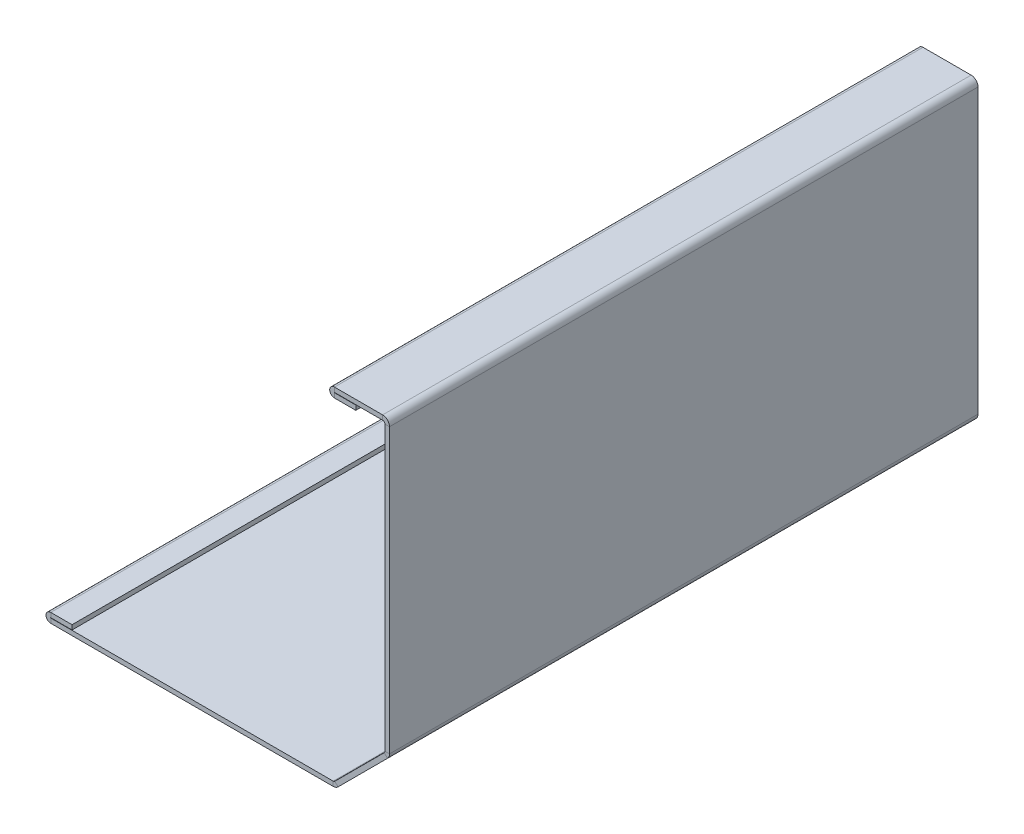
ISO-10303-21;
HEADER;
FILE_DESCRIPTION(('STEP AP214'),'2;1');
FILE_NAME('part.step','',(''),(''),'','','');
FILE_SCHEMA(('AUTOMOTIVE_DESIGN { 1 0 10303 214 1 1 1 1 }'));
ENDSEC;
DATA;
#1=APPLICATION_CONTEXT('core data for automotive mechanical design processes');
#2=APPLICATION_PROTOCOL_DEFINITION('international standard','automotive_design',2000,#1);
#3=PRODUCT_CONTEXT('',#1,'mechanical');
#4=PRODUCT('Part','Part','',(#3));
#5=PRODUCT_RELATED_PRODUCT_CATEGORY('part','',(#4));
#6=PRODUCT_DEFINITION_FORMATION('','',#4);
#7=PRODUCT_DEFINITION_CONTEXT('part definition',#1,'design');
#8=PRODUCT_DEFINITION('design','',#6,#7);
#9=PRODUCT_DEFINITION_SHAPE('','',#8);
#10=(LENGTH_UNIT() NAMED_UNIT(*) SI_UNIT(.MILLI.,.METRE.));
#11=(NAMED_UNIT(*) PLANE_ANGLE_UNIT() SI_UNIT($,.RADIAN.));
#12=(NAMED_UNIT(*) SI_UNIT($,.STERADIAN.) SOLID_ANGLE_UNIT());
#13=UNCERTAINTY_MEASURE_WITH_UNIT(LENGTH_MEASURE(1.E-05),#10,'distance_accuracy_value','');
#14=(GEOMETRIC_REPRESENTATION_CONTEXT(3) GLOBAL_UNCERTAINTY_ASSIGNED_CONTEXT((#13)) GLOBAL_UNIT_ASSIGNED_CONTEXT((#10,
#11,#12)) REPRESENTATION_CONTEXT('',''));
#15=CARTESIAN_POINT('',(0.,0.,0.));
#16=DIRECTION('',(0.,0.,1.));
#17=DIRECTION('',(1.,0.,0.));
#18=AXIS2_PLACEMENT_3D('',#15,#16,#17);
#19=CARTESIAN_POINT('',(65.0606601717799,18.0606601717797,-96.));
#20=DIRECTION('',(0.,0.,-1.));
#21=DIRECTION('',(-1.,0.,0.));
#22=AXIS2_PLACEMENT_3D('',#19,#20,#21);
#23=PLANE('',#22);
#24=DIRECTION('',(0.,-1.,0.));
#25=VECTOR('',#24,1.);
#26=CARTESIAN_POINT('',(63.5606601717799,18.0606601717797,-96.));
#27=LINE('',#26,#25);
#28=CARTESIAN_POINT('',(63.5606601717809,110.80273982822,-96.));
#29=VERTEX_POINT('',#28);
#30=CARTESIAN_POINT('',(63.5606601717799,18.3657698818238,-96.));
#31=VERTEX_POINT('',#30);
#32=EDGE_CURVE('E411',#29,#31,#27,.T.);
#33=ORIENTED_EDGE('',*,*,#32,.F.);
#34=DIRECTION('',(1.,0.,0.));
#35=VECTOR('',#34,1.);
#36=CARTESIAN_POINT('',(63.5606601717809,110.80273982822,-96.));
#37=LINE('',#36,#35);
#38=CARTESIAN_POINT('',(65.0606601717809,110.80273982822,-96.));
#39=VERTEX_POINT('',#38);
#40=EDGE_CURVE('E379',#29,#39,#37,.T.);
#41=ORIENTED_EDGE('',*,*,#40,.T.);
#42=DIRECTION('',(0.,-1.,0.));
#43=VECTOR('',#42,1.);
#44=CARTESIAN_POINT('',(65.0606601717799,18.0606601717797,-96.));
#45=LINE('',#44,#43);
#46=CARTESIAN_POINT('',(65.0606601717799,18.3657698818237,-96.));
#47=VERTEX_POINT('',#46);
#48=EDGE_CURVE('E410',#39,#47,#45,.T.);
#49=ORIENTED_EDGE('',*,*,#48,.T.);
#50=DIRECTION('',(1.,0.,0.));
#51=VECTOR('',#50,1.);
#52=CARTESIAN_POINT('',(63.5606601717799,18.3657698818238,-96.));
#53=LINE('',#52,#51);
#54=EDGE_CURVE('E398',#31,#47,#53,.T.);
#55=ORIENTED_EDGE('',*,*,#54,.F.);
#56=EDGE_LOOP('',(#33,#41,#49,#55));
#57=FACE_BOUND('',#56,.T.);
#58=ADVANCED_FACE('F59',(#57),#23,.T.);
#59=CARTESIAN_POINT('',(65.0606601717797,-6.93865979386305E-13,0.));
#60=DIRECTION('',(1.,0.,0.));
#61=DIRECTION('',(0.,1.,0.));
#62=AXIS2_PLACEMENT_3D('',#59,#60,#61);
#63=PLANE('',#62);
#64=ORIENTED_EDGE('',*,*,#48,.F.);
#65=DIRECTION('',(0.,0.,-1.));
#66=VECTOR('',#65,1.);
#67=CARTESIAN_POINT('',(65.0606601717809,110.80273982822,-95.9999999999999));
#68=LINE('',#67,#66);
#69=CARTESIAN_POINT('',(65.0606601717809,110.80273982822,96.));
#70=VERTEX_POINT('',#69);
#71=EDGE_CURVE('E372',#39,#70,#68,.F.);
#72=ORIENTED_EDGE('',*,*,#71,.T.);
#73=DIRECTION('',(0.,1.,0.));
#74=VECTOR('',#73,1.);
#75=CARTESIAN_POINT('',(65.0606601717809,113.03933982822,96.));
#76=LINE('',#75,#74);
#77=CARTESIAN_POINT('',(65.0606601717799,18.3657698818237,96.));
#78=VERTEX_POINT('',#77);
#79=EDGE_CURVE('E407',#78,#70,#76,.T.);
#80=ORIENTED_EDGE('',*,*,#79,.F.);
#81=DIRECTION('',(0.,0.,-1.));
#82=VECTOR('',#81,1.);
#83=CARTESIAN_POINT('',(65.0606601717799,18.3657698818237,0.));
#84=LINE('',#83,#82);
#85=EDGE_CURVE('E401',#78,#47,#84,.T.);
#86=ORIENTED_EDGE('',*,*,#85,.T.);
#87=EDGE_LOOP('',(#64,#72,#80,#86));
#88=FACE_BOUND('',#87,.T.);
#89=ADVANCED_FACE('F515',(#88),#63,.T.);
#90=CARTESIAN_POINT('',(63.5606601717797,-6.7796203455855E-13,0.));
#91=DIRECTION('',(1.,0.,0.));
#92=DIRECTION('',(0.,1.,0.));
#93=AXIS2_PLACEMENT_3D('',#90,#91,#92);
#94=PLANE('',#93);
#95=DIRECTION('',(0.,0.,-1.));
#96=VECTOR('',#95,1.);
#97=CARTESIAN_POINT('',(63.5606601717809,110.80273982822,-95.9999999999999));
#98=LINE('',#97,#96);
#99=CARTESIAN_POINT('',(63.5606601717809,110.80273982822,96.));
#100=VERTEX_POINT('',#99);
#101=EDGE_CURVE('E385',#29,#100,#98,.F.);
#102=ORIENTED_EDGE('',*,*,#101,.F.);
#103=ORIENTED_EDGE('',*,*,#32,.T.);
#104=DIRECTION('',(0.,0.,-1.));
#105=VECTOR('',#104,1.);
#106=CARTESIAN_POINT('',(63.5606601717799,18.3657698818238,96.));
#107=LINE('',#106,#105);
#108=CARTESIAN_POINT('',(63.5606601717799,18.3657698818238,96.));
#109=VERTEX_POINT('',#108);
#110=EDGE_CURVE('E395',#109,#31,#107,.T.);
#111=ORIENTED_EDGE('',*,*,#110,.F.);
#112=DIRECTION('',(0.,1.,0.));
#113=VECTOR('',#112,1.);
#114=CARTESIAN_POINT('',(63.5606601717809,113.03933982822,96.));
#115=LINE('',#114,#113);
#116=EDGE_CURVE('E406',#109,#100,#115,.T.);
#117=ORIENTED_EDGE('',*,*,#116,.T.);
#118=EDGE_LOOP('',(#102,#103,#111,#117));
#119=FACE_BOUND('',#118,.T.);
#120=ADVANCED_FACE('F526',(#119),#94,.F.);
#121=CARTESIAN_POINT('',(48.0606601717798,0.439339828220174,96.));
#122=DIRECTION('',(0.,0.,-1.));
#123=DIRECTION('',(-1.,0.,0.));
#124=AXIS2_PLACEMENT_3D('',#121,#122,#123);
#125=PLANE('',#124);
#126=DIRECTION('',(0.707106781186536,-0.707106781186559,0.));
#127=VECTOR('',#126,1.);
#128=CARTESIAN_POINT('',(63.3449150268019,17.8449150268018,96.));
#129=LINE('',#128,#127);
#130=CARTESIAN_POINT('',(63.3449150268019,17.8449150268018,96.));
#131=VERTEX_POINT('',#130);
#132=CARTESIAN_POINT('',(64.4055751985818,16.7842548550219,96.));
#133=VERTEX_POINT('',#132);
#134=EDGE_CURVE('E434',#131,#133,#129,.T.);
#135=ORIENTED_EDGE('',*,*,#134,.F.);
#136=DIRECTION('',(-0.707106781186551,-0.707106781186544,0.));
#137=VECTOR('',#136,1.);
#138=CARTESIAN_POINT('',(47.,1.5,96.));
#139=LINE('',#138,#137);
#140=CARTESIAN_POINT('',(47.215745144978,1.71574514497799,96.));
#141=VERTEX_POINT('',#140);
#142=EDGE_CURVE('E450',#131,#141,#139,.T.);
#143=ORIENTED_EDGE('',*,*,#142,.T.);
#144=DIRECTION('',(0.707106781186544,-0.707106781186551,0.));
#145=VECTOR('',#144,1.);
#146=CARTESIAN_POINT('',(47.215745144978,1.71574514497799,96.));
#147=LINE('',#146,#145);
#148=CARTESIAN_POINT('',(48.2764053167578,0.655084973198165,96.));
#149=VERTEX_POINT('',#148);
#150=EDGE_CURVE('E437',#141,#149,#147,.T.);
#151=ORIENTED_EDGE('',*,*,#150,.T.);
#152=DIRECTION('',(-0.707106781186551,-0.707106781186544,0.));
#153=VECTOR('',#152,1.);
#154=CARTESIAN_POINT('',(48.0606601717798,0.439339828220174,96.));
#155=LINE('',#154,#153);
#156=EDGE_CURVE('E451',#133,#149,#155,.T.);
#157=ORIENTED_EDGE('',*,*,#156,.F.);
#158=EDGE_LOOP('',(#135,#143,#151,#157));
#159=FACE_BOUND('',#158,.T.);
#160=ADVANCED_FACE('F534',(#159),#125,.F.);
#161=CARTESIAN_POINT('',(64.6213203435597,16.9999999999999,-96.));
#162=DIRECTION('',(0.,0.,1.));
#163=DIRECTION('',(1.,0.,0.));
#164=AXIS2_PLACEMENT_3D('',#161,#162,#163);
#165=PLANE('',#164);
#166=DIRECTION('',(0.707106781186536,-0.707106781186559,0.));
#167=VECTOR('',#166,1.);
#168=CARTESIAN_POINT('',(63.3449150268019,17.8449150268018,-96.));
#169=LINE('',#168,#167);
#170=CARTESIAN_POINT('',(63.3449150268019,17.8449150268018,-96.));
#171=VERTEX_POINT('',#170);
#172=CARTESIAN_POINT('',(64.4055751985817,16.7842548550219,-96.));
#173=VERTEX_POINT('',#172);
#174=EDGE_CURVE('E423',#171,#173,#169,.T.);
#175=ORIENTED_EDGE('',*,*,#174,.T.);
#176=DIRECTION('',(0.707106781186551,0.707106781186544,0.));
#177=VECTOR('',#176,1.);
#178=CARTESIAN_POINT('',(64.6213203435597,16.9999999999999,-96.));
#179=LINE('',#178,#177);
#180=CARTESIAN_POINT('',(48.2764053167578,0.655084973198164,-96.));
#181=VERTEX_POINT('',#180);
#182=EDGE_CURVE('E453',#181,#173,#179,.T.);
#183=ORIENTED_EDGE('',*,*,#182,.F.);
#184=DIRECTION('',(0.707106781186544,-0.707106781186551,0.));
#185=VECTOR('',#184,1.);
#186=CARTESIAN_POINT('',(47.215745144978,1.71574514497799,-96.));
#187=LINE('',#186,#185);
#188=CARTESIAN_POINT('',(47.215745144978,1.71574514497799,-96.));
#189=VERTEX_POINT('',#188);
#190=EDGE_CURVE('E442',#189,#181,#187,.T.);
#191=ORIENTED_EDGE('',*,*,#190,.F.);
#192=DIRECTION('',(0.707106781186551,0.707106781186544,0.));
#193=VECTOR('',#192,1.);
#194=CARTESIAN_POINT('',(63.5606601717799,18.0606601717797,-96.));
#195=LINE('',#194,#193);
#196=EDGE_CURVE('E454',#189,#171,#195,.T.);
#197=ORIENTED_EDGE('',*,*,#196,.T.);
#198=EDGE_LOOP('',(#175,#183,#191,#197));
#199=FACE_BOUND('',#198,.T.);
#200=ADVANCED_FACE('F498',(#199),#165,.F.);
#201=CARTESIAN_POINT('',(23.8106601717796,-23.8106601717798,0.));
#202=DIRECTION('',(-0.707106781186544,0.707106781186551,0.));
#203=DIRECTION('',(-0.707106781186551,-0.707106781186544,0.));
#204=AXIS2_PLACEMENT_3D('',#201,#202,#203);
#205=PLANE('',#204);
#206=DIRECTION('',(0.,0.,-1.));
#207=VECTOR('',#206,1.);
#208=CARTESIAN_POINT('',(64.4055751985817,16.7842548550219,-96.));
#209=LINE('',#208,#207);
#210=EDGE_CURVE('E417',#173,#133,#209,.F.);
#211=ORIENTED_EDGE('',*,*,#210,.T.);
#212=ORIENTED_EDGE('',*,*,#156,.T.);
#213=DIRECTION('',(0.,0.,1.));
#214=VECTOR('',#213,1.);
#215=CARTESIAN_POINT('',(48.2764053167578,0.655084973198158,0.));
#216=LINE('',#215,#214);
#217=EDGE_CURVE('E445',#181,#149,#216,.T.);
#218=ORIENTED_EDGE('',*,*,#217,.F.);
#219=ORIENTED_EDGE('',*,*,#182,.T.);
#220=EDGE_LOOP('',(#211,#212,#218,#219));
#221=FACE_BOUND('',#220,.T.);
#222=ADVANCED_FACE('F494',(#221),#205,.F.);
#223=CARTESIAN_POINT('',(22.7499999999998,-22.75,0.));
#224=DIRECTION('',(-0.707106781186544,0.707106781186551,0.));
#225=DIRECTION('',(-0.707106781186551,-0.707106781186544,0.));
#226=AXIS2_PLACEMENT_3D('',#223,#224,#225);
#227=PLANE('',#226);
#228=ORIENTED_EDGE('',*,*,#142,.F.);
#229=DIRECTION('',(0.,0.,-1.));
#230=VECTOR('',#229,1.);
#231=CARTESIAN_POINT('',(63.3449150268019,17.8449150268018,-96.));
#232=LINE('',#231,#230);
#233=EDGE_CURVE('E429',#171,#131,#232,.F.);
#234=ORIENTED_EDGE('',*,*,#233,.F.);
#235=ORIENTED_EDGE('',*,*,#196,.F.);
#236=DIRECTION('',(0.,0.,-1.));
#237=VECTOR('',#236,1.);
#238=CARTESIAN_POINT('',(47.215745144978,1.71574514497799,96.));
#239=LINE('',#238,#237);
#240=EDGE_CURVE('E440',#141,#189,#239,.T.);
#241=ORIENTED_EDGE('',*,*,#240,.F.);
#242=EDGE_LOOP('',(#228,#234,#235,#241));
#243=FACE_BOUND('',#242,.T.);
#244=ADVANCED_FACE('F531',(#243),#227,.T.);
#245=CARTESIAN_POINT('',(47.,1.5,96.));
#246=DIRECTION('',(0.,0.,-1.));
#247=DIRECTION('',(-1.,0.,0.));
#248=AXIS2_PLACEMENT_3D('',#245,#246,#247);
#249=PLANE('',#248);
#250=DIRECTION('',(1.,0.,0.));
#251=VECTOR('',#250,1.);
#252=CARTESIAN_POINT('',(47.,1.5,96.));
#253=LINE('',#252,#251);
#254=CARTESIAN_POINT('',(-45.45,1.5,96.));
#255=VERTEX_POINT('',#254);
#256=CARTESIAN_POINT('',(46.694890289956,1.5,96.));
#257=VERTEX_POINT('',#256);
#258=EDGE_CURVE('E68',#255,#257,#253,.T.);
#259=ORIENTED_EDGE('',*,*,#258,.F.);
#260=DIRECTION('',(0.,-1.,0.));
#261=VECTOR('',#260,1.);
#262=CARTESIAN_POINT('',(-45.45,1.5,96.));
#263=LINE('',#262,#261);
#264=CARTESIAN_POINT('',(-45.45,0.,96.));
#265=VERTEX_POINT('',#264);
#266=EDGE_CURVE('E253',#255,#265,#263,.T.);
#267=ORIENTED_EDGE('',*,*,#266,.T.);
#268=DIRECTION('',(1.,0.,0.));
#269=VECTOR('',#268,1.);
#270=CARTESIAN_POINT('',(47.,0.,96.));
#271=LINE('',#270,#269);
#272=CARTESIAN_POINT('',(46.694890289956,0.,96.));
#273=VERTEX_POINT('',#272);
#274=EDGE_CURVE('E233',#265,#273,#271,.T.);
#275=ORIENTED_EDGE('',*,*,#274,.T.);
#276=DIRECTION('',(0.,-1.,0.));
#277=VECTOR('',#276,1.);
#278=CARTESIAN_POINT('',(46.694890289956,1.50000000000001,96.));
#279=LINE('',#278,#277);
#280=EDGE_CURVE('E476',#257,#273,#279,.T.);
#281=ORIENTED_EDGE('',*,*,#280,.F.);
#282=EDGE_LOOP('',(#259,#267,#275,#281));
#283=FACE_BOUND('',#282,.T.);
#284=ADVANCED_FACE('F61',(#283),#249,.F.);
#285=CARTESIAN_POINT('',(47.,1.5,-96.));
#286=DIRECTION('',(0.,0.,1.));
#287=DIRECTION('',(1.,0.,0.));
#288=AXIS2_PLACEMENT_3D('',#285,#286,#287);
#289=PLANE('',#288);
#290=DIRECTION('',(-1.,0.,0.));
#291=VECTOR('',#290,1.);
#292=CARTESIAN_POINT('',(47.,0.,-96.));
#293=LINE('',#292,#291);
#294=CARTESIAN_POINT('',(46.694890289956,0.,-96.));
#295=VERTEX_POINT('',#294);
#296=CARTESIAN_POINT('',(-45.45,0.,-96.));
#297=VERTEX_POINT('',#296);
#298=EDGE_CURVE('E63',#295,#297,#293,.T.);
#299=ORIENTED_EDGE('',*,*,#298,.T.);
#300=DIRECTION('',(0.,-1.,0.));
#301=VECTOR('',#300,1.);
#302=CARTESIAN_POINT('',(-45.45,1.5,-96.));
#303=LINE('',#302,#301);
#304=CARTESIAN_POINT('',(-45.45,1.5,-96.));
#305=VERTEX_POINT('',#304);
#306=EDGE_CURVE('E227',#305,#297,#303,.T.);
#307=ORIENTED_EDGE('',*,*,#306,.F.);
#308=DIRECTION('',(-1.,0.,0.));
#309=VECTOR('',#308,1.);
#310=CARTESIAN_POINT('',(47.,1.5,-96.));
#311=LINE('',#310,#309);
#312=CARTESIAN_POINT('',(46.694890289956,1.5,-96.));
#313=VERTEX_POINT('',#312);
#314=EDGE_CURVE('E13',#313,#305,#311,.T.);
#315=ORIENTED_EDGE('',*,*,#314,.F.);
#316=DIRECTION('',(0.,-1.,0.));
#317=VECTOR('',#316,1.);
#318=CARTESIAN_POINT('',(46.694890289956,1.50000000000001,-96.));
#319=LINE('',#318,#317);
#320=EDGE_CURVE('E229',#313,#295,#319,.T.);
#321=ORIENTED_EDGE('',*,*,#320,.T.);
#322=EDGE_LOOP('',(#299,#307,#315,#321));
#323=FACE_BOUND('',#322,.T.);
#324=ADVANCED_FACE('F224',(#323),#289,.F.);
#325=CARTESIAN_POINT('',(0.,1.5,0.));
#326=DIRECTION('',(0.,1.,0.));
#327=DIRECTION('',(0.,0.,1.));
#328=AXIS2_PLACEMENT_3D('',#325,#326,#327);
#329=PLANE('',#328);
#330=DIRECTION('',(0.,0.,1.));
#331=VECTOR('',#330,1.);
#332=CARTESIAN_POINT('',(-45.45,1.5,96.));
#333=LINE('',#332,#331);
#334=EDGE_CURVE('E263',#255,#305,#333,.F.);
#335=ORIENTED_EDGE('',*,*,#334,.F.);
#336=ORIENTED_EDGE('',*,*,#258,.T.);
#337=DIRECTION('',(0.,0.,-1.));
#338=VECTOR('',#337,1.);
#339=CARTESIAN_POINT('',(46.694890289956,1.50000000000001,-96.));
#340=LINE('',#339,#338);
#341=EDGE_CURVE('E471',#313,#257,#340,.F.);
#342=ORIENTED_EDGE('',*,*,#341,.F.);
#343=ORIENTED_EDGE('',*,*,#314,.T.);
#344=EDGE_LOOP('',(#335,#336,#342,#343));
#345=FACE_BOUND('',#344,.T.);
#346=ADVANCED_FACE('F539',(#345),#329,.T.);
#347=CARTESIAN_POINT('',(0.,0.,0.));
#348=DIRECTION('',(0.,1.,0.));
#349=DIRECTION('',(0.,0.,1.));
#350=AXIS2_PLACEMENT_3D('',#347,#348,#349);
#351=PLANE('',#350);
#352=ORIENTED_EDGE('',*,*,#274,.F.);
#353=DIRECTION('',(0.,0.,1.));
#354=VECTOR('',#353,1.);
#355=CARTESIAN_POINT('',(-45.45,0.,96.));
#356=LINE('',#355,#354);
#357=EDGE_CURVE('E236',#265,#297,#356,.F.);
#358=ORIENTED_EDGE('',*,*,#357,.T.);
#359=ORIENTED_EDGE('',*,*,#298,.F.);
#360=DIRECTION('',(0.,0.,-1.));
#361=VECTOR('',#360,1.);
#362=CARTESIAN_POINT('',(46.694890289956,0.,-96.));
#363=LINE('',#362,#361);
#364=EDGE_CURVE('E460',#295,#273,#363,.F.);
#365=ORIENTED_EDGE('',*,*,#364,.T.);
#366=EDGE_LOOP('',(#352,#358,#359,#365));
#367=FACE_BOUND('',#366,.T.);
#368=ADVANCED_FACE('F237',(#367),#351,.F.);
#369=CARTESIAN_POINT('',(46.694890289956,2.23659999999999,96.));
#370=DIRECTION('',(0.,0.,1.));
#371=DIRECTION('',(1.,0.,0.));
#372=AXIS2_PLACEMENT_3D('',#369,#370,#371);
#373=PLANE('',#372);
#374=ORIENTED_EDGE('',*,*,#150,.F.);
#375=CARTESIAN_POINT('',(46.694890289956,2.23659999999999,96.));
#376=DIRECTION('',(0.,0.,-1.));
#377=DIRECTION('',(-1.,0.,0.));
#378=AXIS2_PLACEMENT_3D('',#375,#376,#377);
#379=CIRCLE('',#378,0.736599999999985);
#380=EDGE_CURVE('E468',#257,#141,#379,.F.);
#381=ORIENTED_EDGE('',*,*,#380,.F.);
#382=ORIENTED_EDGE('',*,*,#280,.T.);
#383=CARTESIAN_POINT('',(46.694890289956,2.23659999999999,96.));
#384=DIRECTION('',(0.,0.,-1.));
#385=DIRECTION('',(-1.,0.,0.));
#386=AXIS2_PLACEMENT_3D('',#383,#384,#385);
#387=CIRCLE('',#386,2.23659999999999);
#388=EDGE_CURVE('E462',#273,#149,#387,.F.);
#389=ORIENTED_EDGE('',*,*,#388,.T.);
#390=EDGE_LOOP('',(#374,#381,#382,#389));
#391=FACE_BOUND('',#390,.T.);
#392=ADVANCED_FACE('F489',(#391),#373,.T.);
#393=CARTESIAN_POINT('',(46.694890289956,2.23659999999999,-96.));
#394=DIRECTION('',(0.,0.,1.));
#395=DIRECTION('',(1.,0.,0.));
#396=AXIS2_PLACEMENT_3D('',#393,#394,#395);
#397=PLANE('',#396);
#398=CARTESIAN_POINT('',(46.694890289956,2.23659999999999,-96.));
#399=DIRECTION('',(0.,0.,-1.));
#400=DIRECTION('',(-1.,0.,0.));
#401=AXIS2_PLACEMENT_3D('',#398,#399,#400);
#402=CIRCLE('',#401,0.736599999999985);
#403=EDGE_CURVE('E456',#189,#313,#402,.T.);
#404=ORIENTED_EDGE('',*,*,#403,.F.);
#405=ORIENTED_EDGE('',*,*,#190,.T.);
#406=CARTESIAN_POINT('',(46.694890289956,2.23659999999999,-96.));
#407=DIRECTION('',(0.,0.,-1.));
#408=DIRECTION('',(-1.,0.,0.));
#409=AXIS2_PLACEMENT_3D('',#406,#407,#408);
#410=CIRCLE('',#409,2.23659999999999);
#411=EDGE_CURVE('E463',#181,#295,#410,.T.);
#412=ORIENTED_EDGE('',*,*,#411,.T.);
#413=ORIENTED_EDGE('',*,*,#320,.F.);
#414=EDGE_LOOP('',(#404,#405,#412,#413));
#415=FACE_BOUND('',#414,.T.);
#416=ADVANCED_FACE('F541',(#415),#397,.F.);
#417=CARTESIAN_POINT('',(46.694890289956,2.23659999999999,-96.));
#418=DIRECTION('',(0.,0.,-1.));
#419=DIRECTION('',(0.707106781186544,-0.707106781186551,0.));
#420=AXIS2_PLACEMENT_3D('',#417,#418,#419);
#421=CYLINDRICAL_SURFACE('',#420,2.23659999999999);
#422=ORIENTED_EDGE('',*,*,#364,.F.);
#423=ORIENTED_EDGE('',*,*,#411,.F.);
#424=ORIENTED_EDGE('',*,*,#217,.T.);
#425=ORIENTED_EDGE('',*,*,#388,.F.);
#426=EDGE_LOOP('',(#422,#423,#424,#425));
#427=FACE_BOUND('',#426,.T.);
#428=ADVANCED_FACE('F490',(#427),#421,.T.);
#429=CARTESIAN_POINT('',(46.694890289956,2.23659999999999,-96.));
#430=DIRECTION('',(0.,0.,-1.));
#431=DIRECTION('',(0.707106781186544,-0.707106781186551,0.));
#432=AXIS2_PLACEMENT_3D('',#429,#430,#431);
#433=CYLINDRICAL_SURFACE('',#432,0.736599999999985);
#434=ORIENTED_EDGE('',*,*,#341,.T.);
#435=ORIENTED_EDGE('',*,*,#380,.T.);
#436=ORIENTED_EDGE('',*,*,#240,.T.);
#437=ORIENTED_EDGE('',*,*,#403,.T.);
#438=EDGE_LOOP('',(#434,#435,#436,#437));
#439=FACE_BOUND('',#438,.T.);
#440=ADVANCED_FACE('F536',(#439),#433,.F.);
#441=CARTESIAN_POINT('',(62.82406017178,18.3657698818238,96.));
#442=DIRECTION('',(0.,0.,1.));
#443=DIRECTION('',(1.,0.,0.));
#444=AXIS2_PLACEMENT_3D('',#441,#442,#443);
#445=PLANE('',#444);
#446=DIRECTION('',(1.,0.,0.));
#447=VECTOR('',#446,1.);
#448=CARTESIAN_POINT('',(63.5606601717799,18.3657698818238,96.));
#449=LINE('',#448,#447);
#450=EDGE_CURVE('E392',#109,#78,#449,.T.);
#451=ORIENTED_EDGE('',*,*,#450,.F.);
#452=CARTESIAN_POINT('',(62.82406017178,18.3657698818238,96.));
#453=DIRECTION('',(0.,0.,-1.));
#454=DIRECTION('',(-1.,0.,0.));
#455=AXIS2_PLACEMENT_3D('',#452,#453,#454);
#456=CIRCLE('',#455,0.736599999999976);
#457=EDGE_CURVE('E426',#131,#109,#456,.F.);
#458=ORIENTED_EDGE('',*,*,#457,.F.);
#459=ORIENTED_EDGE('',*,*,#134,.T.);
#460=CARTESIAN_POINT('',(62.82406017178,18.3657698818238,96.));
#461=DIRECTION('',(0.,0.,-1.));
#462=DIRECTION('',(-1.,0.,0.));
#463=AXIS2_PLACEMENT_3D('',#460,#461,#462);
#464=CIRCLE('',#463,2.23659999999998);
#465=EDGE_CURVE('E419',#133,#78,#464,.F.);
#466=ORIENTED_EDGE('',*,*,#465,.T.);
#467=EDGE_LOOP('',(#451,#458,#459,#466));
#468=FACE_BOUND('',#467,.T.);
#469=ADVANCED_FACE('F517',(#468),#445,.T.);
#470=CARTESIAN_POINT('',(62.82406017178,18.3657698818238,-96.));
#471=DIRECTION('',(0.,0.,1.));
#472=DIRECTION('',(1.,0.,0.));
#473=AXIS2_PLACEMENT_3D('',#470,#471,#472);
#474=PLANE('',#473);
#475=CARTESIAN_POINT('',(62.82406017178,18.3657698818238,-96.));
#476=DIRECTION('',(0.,0.,-1.));
#477=DIRECTION('',(-1.,0.,0.));
#478=AXIS2_PLACEMENT_3D('',#475,#476,#477);
#479=CIRCLE('',#478,0.736599999999976);
#480=EDGE_CURVE('E413',#31,#171,#479,.T.);
#481=ORIENTED_EDGE('',*,*,#480,.F.);
#482=ORIENTED_EDGE('',*,*,#54,.T.);
#483=CARTESIAN_POINT('',(62.82406017178,18.3657698818238,-96.));
#484=DIRECTION('',(0.,0.,-1.));
#485=DIRECTION('',(-1.,0.,0.));
#486=AXIS2_PLACEMENT_3D('',#483,#484,#485);
#487=CIRCLE('',#486,2.23659999999998);
#488=EDGE_CURVE('E420',#47,#173,#487,.T.);
#489=ORIENTED_EDGE('',*,*,#488,.T.);
#490=ORIENTED_EDGE('',*,*,#174,.F.);
#491=EDGE_LOOP('',(#481,#482,#489,#490));
#492=FACE_BOUND('',#491,.T.);
#493=ADVANCED_FACE('F508',(#492),#474,.F.);
#494=CARTESIAN_POINT('',(62.82406017178,18.3657698818238,-96.));
#495=DIRECTION('',(0.,0.,-1.));
#496=DIRECTION('',(1.,0.,0.));
#497=AXIS2_PLACEMENT_3D('',#494,#495,#496);
#498=CYLINDRICAL_SURFACE('',#497,2.23659999999998);
#499=ORIENTED_EDGE('',*,*,#210,.F.);
#500=ORIENTED_EDGE('',*,*,#488,.F.);
#501=ORIENTED_EDGE('',*,*,#85,.F.);
#502=ORIENTED_EDGE('',*,*,#465,.F.);
#503=EDGE_LOOP('',(#499,#500,#501,#502));
#504=FACE_BOUND('',#503,.T.);
#505=ADVANCED_FACE('F507',(#504),#498,.T.);
#506=CARTESIAN_POINT('',(62.82406017178,18.3657698818238,-96.));
#507=DIRECTION('',(0.,0.,-1.));
#508=DIRECTION('',(1.,0.,0.));
#509=AXIS2_PLACEMENT_3D('',#506,#507,#508);
#510=CYLINDRICAL_SURFACE('',#509,0.736599999999976);
#511=ORIENTED_EDGE('',*,*,#233,.T.);
#512=ORIENTED_EDGE('',*,*,#457,.T.);
#513=ORIENTED_EDGE('',*,*,#110,.T.);
#514=ORIENTED_EDGE('',*,*,#480,.T.);
#515=EDGE_LOOP('',(#511,#512,#513,#514));
#516=FACE_BOUND('',#515,.T.);
#517=ADVANCED_FACE('F528',(#516),#510,.F.);
#518=CARTESIAN_POINT('',(65.0606601717809,113.03933982822,96.));
#519=DIRECTION('',(0.,0.,1.));
#520=DIRECTION('',(1.,0.,0.));
#521=AXIS2_PLACEMENT_3D('',#518,#519,#520);
#522=PLANE('',#521);
#523=DIRECTION('',(1.,0.,0.));
#524=VECTOR('',#523,1.);
#525=CARTESIAN_POINT('',(63.5606601717809,110.80273982822,96.));
#526=LINE('',#525,#524);
#527=EDGE_CURVE('E389',#100,#70,#526,.T.);
#528=ORIENTED_EDGE('',*,*,#527,.F.);
#529=ORIENTED_EDGE('',*,*,#116,.F.);
#530=ORIENTED_EDGE('',*,*,#450,.T.);
#531=ORIENTED_EDGE('',*,*,#79,.T.);
#532=EDGE_LOOP('',(#528,#529,#530,#531));
#533=FACE_BOUND('',#532,.T.);
#534=ADVANCED_FACE('F522',(#533),#522,.T.);
#535=CARTESIAN_POINT('',(62.8240601717809,110.80273982822,96.));
#536=DIRECTION('',(0.,0.,1.));
#537=DIRECTION('',(1.,0.,0.));
#538=AXIS2_PLACEMENT_3D('',#535,#536,#537);
#539=PLANE('',#538);
#540=DIRECTION('',(0.,-1.,0.));
#541=VECTOR('',#540,1.);
#542=CARTESIAN_POINT('',(62.8240601717809,113.03933982822,96.));
#543=LINE('',#542,#541);
#544=CARTESIAN_POINT('',(62.8240601717809,111.53933982822,96.));
#545=VERTEX_POINT('',#544);
#546=CARTESIAN_POINT('',(62.8240601717809,113.03933982822,95.9999999999999));
#547=VERTEX_POINT('',#546);
#548=EDGE_CURVE('E351',#545,#547,#543,.F.);
#549=ORIENTED_EDGE('',*,*,#548,.F.);
#550=CARTESIAN_POINT('',(62.8240601717809,110.80273982822,96.));
#551=DIRECTION('',(0.,0.,-1.));
#552=DIRECTION('',(-1.,0.,0.));
#553=AXIS2_PLACEMENT_3D('',#550,#551,#552);
#554=CIRCLE('',#553,0.73659999999999);
#555=EDGE_CURVE('E382',#100,#545,#554,.F.);
#556=ORIENTED_EDGE('',*,*,#555,.F.);
#557=ORIENTED_EDGE('',*,*,#527,.T.);
#558=CARTESIAN_POINT('',(62.8240601717809,110.80273982822,95.9999999999999));
#559=DIRECTION('',(0.,0.,-1.));
#560=DIRECTION('',(-1.,0.,0.));
#561=AXIS2_PLACEMENT_3D('',#558,#559,#560);
#562=CIRCLE('',#561,2.23659999999999);
#563=EDGE_CURVE('E375',#70,#547,#562,.F.);
#564=ORIENTED_EDGE('',*,*,#563,.T.);
#565=EDGE_LOOP('',(#549,#556,#557,#564));
#566=FACE_BOUND('',#565,.T.);
#567=ADVANCED_FACE('F561',(#566),#539,.T.);
#568=CARTESIAN_POINT('',(62.8240601717809,110.80273982822,-96.));
#569=DIRECTION('',(0.,0.,1.));
#570=DIRECTION('',(1.,0.,0.));
#571=AXIS2_PLACEMENT_3D('',#568,#569,#570);
#572=PLANE('',#571);
#573=CARTESIAN_POINT('',(62.8240601717809,110.80273982822,-96.));
#574=DIRECTION('',(0.,0.,-1.));
#575=DIRECTION('',(-1.,0.,0.));
#576=AXIS2_PLACEMENT_3D('',#573,#574,#575);
#577=CIRCLE('',#576,0.73659999999999);
#578=CARTESIAN_POINT('',(62.8240601717809,111.53933982822,-96.));
#579=VERTEX_POINT('',#578);
#580=EDGE_CURVE('E355',#579,#29,#577,.T.);
#581=ORIENTED_EDGE('',*,*,#580,.F.);
#582=DIRECTION('',(0.,-1.,0.));
#583=VECTOR('',#582,1.);
#584=CARTESIAN_POINT('',(62.8240601717809,111.53933982822,-96.));
#585=LINE('',#584,#583);
#586=CARTESIAN_POINT('',(62.8240601717809,113.03933982822,-96.));
#587=VERTEX_POINT('',#586);
#588=EDGE_CURVE('E365',#579,#587,#585,.F.);
#589=ORIENTED_EDGE('',*,*,#588,.T.);
#590=CARTESIAN_POINT('',(62.8240601717809,110.80273982822,-96.));
#591=DIRECTION('',(0.,0.,-1.));
#592=DIRECTION('',(-1.,0.,0.));
#593=AXIS2_PLACEMENT_3D('',#590,#591,#592);
#594=CIRCLE('',#593,2.23659999999999);
#595=EDGE_CURVE('E376',#587,#39,#594,.T.);
#596=ORIENTED_EDGE('',*,*,#595,.T.);
#597=ORIENTED_EDGE('',*,*,#40,.F.);
#598=EDGE_LOOP('',(#581,#589,#596,#597));
#599=FACE_BOUND('',#598,.T.);
#600=ADVANCED_FACE('F612',(#599),#572,.F.);
#601=CARTESIAN_POINT('',(62.8240601717809,110.80273982822,-95.9999999999999));
#602=DIRECTION('',(0.,0.,-1.));
#603=DIRECTION('',(0.,1.,0.));
#604=AXIS2_PLACEMENT_3D('',#601,#602,#603);
#605=CYLINDRICAL_SURFACE('',#604,2.23659999999999);
#606=ORIENTED_EDGE('',*,*,#71,.F.);
#607=ORIENTED_EDGE('',*,*,#595,.F.);
#608=DIRECTION('',(0.,0.,-1.));
#609=VECTOR('',#608,1.);
#610=CARTESIAN_POINT('',(62.8240601717809,113.03933982822,96.));
#611=LINE('',#610,#609);
#612=EDGE_CURVE('E362',#587,#547,#611,.F.);
#613=ORIENTED_EDGE('',*,*,#612,.T.);
#614=ORIENTED_EDGE('',*,*,#563,.F.);
#615=EDGE_LOOP('',(#606,#607,#613,#614));
#616=FACE_BOUND('',#615,.T.);
#617=ADVANCED_FACE('F620',(#616),#605,.T.);
#618=CARTESIAN_POINT('',(62.8240601717809,110.80273982822,-95.9999999999999));
#619=DIRECTION('',(0.,0.,-1.));
#620=DIRECTION('',(0.,1.,0.));
#621=AXIS2_PLACEMENT_3D('',#618,#619,#620);
#622=CYLINDRICAL_SURFACE('',#621,0.73659999999999);
#623=ORIENTED_EDGE('',*,*,#101,.T.);
#624=ORIENTED_EDGE('',*,*,#555,.T.);
#625=DIRECTION('',(0.,0.,-1.));
#626=VECTOR('',#625,1.);
#627=CARTESIAN_POINT('',(62.8240601717809,111.53933982822,96.));
#628=LINE('',#627,#626);
#629=EDGE_CURVE('E368',#545,#579,#628,.T.);
#630=ORIENTED_EDGE('',*,*,#629,.T.);
#631=ORIENTED_EDGE('',*,*,#580,.T.);
#632=EDGE_LOOP('',(#623,#624,#630,#631));
#633=FACE_BOUND('',#632,.T.);
#634=ADVANCED_FACE('F628',(#633),#622,.F.);
#635=CARTESIAN_POINT('',(63.560660171781,113.03933982822,96.));
#636=DIRECTION('',(0.,0.,-1.));
#637=DIRECTION('',(-1.,0.,0.));
#638=AXIS2_PLACEMENT_3D('',#635,#636,#637);
#639=PLANE('',#638);
#640=DIRECTION('',(1.,0.,0.));
#641=VECTOR('',#640,1.);
#642=CARTESIAN_POINT('',(1.57397319407974E-12,113.039339828221,96.));
#643=LINE('',#642,#641);
#644=CARTESIAN_POINT('',(47.1106601717809,113.03933982822,96.));
#645=VERTEX_POINT('',#644);
#646=EDGE_CURVE('E356',#645,#547,#643,.T.);
#647=ORIENTED_EDGE('',*,*,#646,.F.);
#648=DIRECTION('',(0.,1.,0.));
#649=VECTOR('',#648,1.);
#650=CARTESIAN_POINT('',(47.1106601717809,111.53933982822,96.));
#651=LINE('',#650,#649);
#652=CARTESIAN_POINT('',(47.1106601717809,111.53933982822,96.));
#653=VERTEX_POINT('',#652);
#654=EDGE_CURVE('E315',#653,#645,#651,.T.);
#655=ORIENTED_EDGE('',*,*,#654,.F.);
#656=DIRECTION('',(-1.,0.,0.));
#657=VECTOR('',#656,1.);
#658=CARTESIAN_POINT('',(63.5606601717809,111.53933982822,96.));
#659=LINE('',#658,#657);
#660=EDGE_CURVE('E360',#653,#545,#659,.F.);
#661=ORIENTED_EDGE('',*,*,#660,.T.);
#662=ORIENTED_EDGE('',*,*,#548,.T.);
#663=EDGE_LOOP('',(#647,#655,#661,#662));
#664=FACE_BOUND('',#663,.T.);
#665=ADVANCED_FACE('F636',(#664),#639,.F.);
#666=CARTESIAN_POINT('',(45.5606601717809,113.03933982822,-96.));
#667=DIRECTION('',(0.,0.,1.));
#668=DIRECTION('',(1.,0.,0.));
#669=AXIS2_PLACEMENT_3D('',#666,#667,#668);
#670=PLANE('',#669);
#671=DIRECTION('',(1.,0.,0.));
#672=VECTOR('',#671,1.);
#673=CARTESIAN_POINT('',(45.5606601717809,111.53933982822,-96.));
#674=LINE('',#673,#672);
#675=CARTESIAN_POINT('',(47.1106601717809,111.53933982822,-96.));
#676=VERTEX_POINT('',#675);
#677=EDGE_CURVE('E358',#579,#676,#674,.F.);
#678=ORIENTED_EDGE('',*,*,#677,.T.);
#679=DIRECTION('',(0.,1.,0.));
#680=VECTOR('',#679,1.);
#681=CARTESIAN_POINT('',(47.1106601717809,111.53933982822,-96.));
#682=LINE('',#681,#680);
#683=CARTESIAN_POINT('',(47.1106601717809,113.03933982822,-96.));
#684=VERTEX_POINT('',#683);
#685=EDGE_CURVE('E76',#676,#684,#682,.T.);
#686=ORIENTED_EDGE('',*,*,#685,.T.);
#687=DIRECTION('',(-1.,0.,0.));
#688=VECTOR('',#687,1.);
#689=CARTESIAN_POINT('',(1.57397319407974E-12,113.039339828221,-96.));
#690=LINE('',#689,#688);
#691=EDGE_CURVE('E353',#587,#684,#690,.T.);
#692=ORIENTED_EDGE('',*,*,#691,.F.);
#693=ORIENTED_EDGE('',*,*,#588,.F.);
#694=EDGE_LOOP('',(#678,#686,#692,#693));
#695=FACE_BOUND('',#694,.T.);
#696=ADVANCED_FACE('F645',(#695),#670,.F.);
#697=CARTESIAN_POINT('',(1.57397319407974E-12,113.039339828221,0.));
#698=DIRECTION('',(0.,-1.,0.));
#699=DIRECTION('',(1.,0.,0.));
#700=AXIS2_PLACEMENT_3D('',#697,#698,#699);
#701=PLANE('',#700);
#702=ORIENTED_EDGE('',*,*,#691,.T.);
#703=DIRECTION('',(0.,0.,-1.));
#704=VECTOR('',#703,1.);
#705=CARTESIAN_POINT('',(47.1106601717809,113.03933982822,-96.));
#706=LINE('',#705,#704);
#707=EDGE_CURVE('E300',#684,#645,#706,.F.);
#708=ORIENTED_EDGE('',*,*,#707,.T.);
#709=ORIENTED_EDGE('',*,*,#646,.T.);
#710=ORIENTED_EDGE('',*,*,#612,.F.);
#711=EDGE_LOOP('',(#702,#708,#709,#710));
#712=FACE_BOUND('',#711,.T.);
#713=ADVANCED_FACE('F654',(#712),#701,.F.);
#714=CARTESIAN_POINT('',(1.5527364049007E-12,111.539339828221,0.));
#715=DIRECTION('',(0.,-1.,0.));
#716=DIRECTION('',(1.,0.,0.));
#717=AXIS2_PLACEMENT_3D('',#714,#715,#716);
#718=PLANE('',#717);
#719=DIRECTION('',(0.,0.,-1.));
#720=VECTOR('',#719,1.);
#721=CARTESIAN_POINT('',(47.1106601717809,111.53933982822,-96.));
#722=LINE('',#721,#720);
#723=EDGE_CURVE('E84',#676,#653,#722,.F.);
#724=ORIENTED_EDGE('',*,*,#723,.F.);
#725=ORIENTED_EDGE('',*,*,#677,.F.);
#726=ORIENTED_EDGE('',*,*,#629,.F.);
#727=ORIENTED_EDGE('',*,*,#660,.F.);
#728=EDGE_LOOP('',(#724,#725,#726,#727));
#729=FACE_BOUND('',#728,.T.);
#730=ADVANCED_FACE('F661',(#729),#718,.T.);
#731=CARTESIAN_POINT('',(50.5856601717809,109.93933982822,-96.));
#732=DIRECTION('',(0.,0.,1.));
#733=DIRECTION('',(-1.,0.,0.));
#734=AXIS2_PLACEMENT_3D('',#731,#732,#733);
#735=PLANE('',#734);
#736=DIRECTION('',(0.,-1.,0.));
#737=VECTOR('',#736,1.);
#738=CARTESIAN_POINT('',(47.1106601717809,109.93933982822,-96.));
#739=LINE('',#738,#737);
#740=CARTESIAN_POINT('',(47.1106601717809,111.43933982822,-96.));
#741=VERTEX_POINT('',#740);
#742=CARTESIAN_POINT('',(47.1106601717809,109.93933982822,-96.));
#743=VERTEX_POINT('',#742);
#744=EDGE_CURVE('E345',#741,#743,#739,.T.);
#745=ORIENTED_EDGE('',*,*,#744,.F.);
#746=DIRECTION('',(1.,0.,0.));
#747=VECTOR('',#746,1.);
#748=CARTESIAN_POINT('',(50.5856601717809,111.43933982822,-96.));
#749=LINE('',#748,#747);
#750=CARTESIAN_POINT('',(54.0606601717809,111.43933982822,-96.));
#751=VERTEX_POINT('',#750);
#752=EDGE_CURVE('E336',#751,#741,#749,.F.);
#753=ORIENTED_EDGE('',*,*,#752,.F.);
#754=DIRECTION('',(0.,-1.,0.));
#755=VECTOR('',#754,1.);
#756=CARTESIAN_POINT('',(54.0606601717809,109.93933982822,-96.));
#757=LINE('',#756,#755);
#758=CARTESIAN_POINT('',(54.0606601717809,109.93933982822,-96.));
#759=VERTEX_POINT('',#758);
#760=EDGE_CURVE('E343',#751,#759,#757,.T.);
#761=ORIENTED_EDGE('',*,*,#760,.T.);
#762=DIRECTION('',(-1.,0.,0.));
#763=VECTOR('',#762,1.);
#764=CARTESIAN_POINT('',(50.5856601717809,109.93933982822,-96.));
#765=LINE('',#764,#763);
#766=EDGE_CURVE('E324',#759,#743,#765,.T.);
#767=ORIENTED_EDGE('',*,*,#766,.T.);
#768=EDGE_LOOP('',(#745,#753,#761,#767));
#769=FACE_BOUND('',#768,.T.);
#770=ADVANCED_FACE('F669',(#769),#735,.F.);
#771=CARTESIAN_POINT('',(54.0606601717809,109.93933982822,0.));
#772=DIRECTION('',(-1.,0.,0.));
#773=DIRECTION('',(0.,0.,-1.));
#774=AXIS2_PLACEMENT_3D('',#771,#772,#773);
#775=PLANE('',#774);
#776=ORIENTED_EDGE('',*,*,#760,.F.);
#777=DIRECTION('',(0.,0.,1.));
#778=VECTOR('',#777,1.);
#779=CARTESIAN_POINT('',(54.0606601717809,111.43933982822,0.));
#780=LINE('',#779,#778);
#781=CARTESIAN_POINT('',(54.0606601717809,111.43933982822,96.));
#782=VERTEX_POINT('',#781);
#783=EDGE_CURVE('E333',#782,#751,#780,.F.);
#784=ORIENTED_EDGE('',*,*,#783,.F.);
#785=DIRECTION('',(0.,-1.,0.));
#786=VECTOR('',#785,1.);
#787=CARTESIAN_POINT('',(54.0606601717809,109.93933982822,96.));
#788=LINE('',#787,#786);
#789=CARTESIAN_POINT('',(54.0606601717809,109.93933982822,96.));
#790=VERTEX_POINT('',#789);
#791=EDGE_CURVE('E323',#782,#790,#788,.T.);
#792=ORIENTED_EDGE('',*,*,#791,.T.);
#793=DIRECTION('',(0.,0.,-1.));
#794=VECTOR('',#793,1.);
#795=CARTESIAN_POINT('',(54.0606601717809,109.93933982822,0.));
#796=LINE('',#795,#794);
#797=EDGE_CURVE('E320',#790,#759,#796,.T.);
#798=ORIENTED_EDGE('',*,*,#797,.T.);
#799=EDGE_LOOP('',(#776,#784,#792,#798));
#800=FACE_BOUND('',#799,.T.);
#801=ADVANCED_FACE('F676',(#800),#775,.F.);
#802=CARTESIAN_POINT('',(50.5856601717809,109.93933982822,96.));
#803=DIRECTION('',(0.,0.,-1.));
#804=DIRECTION('',(1.,0.,0.));
#805=AXIS2_PLACEMENT_3D('',#802,#803,#804);
#806=PLANE('',#805);
#807=DIRECTION('',(1.,0.,0.));
#808=VECTOR('',#807,1.);
#809=CARTESIAN_POINT('',(50.5856601717809,111.43933982822,96.));
#810=LINE('',#809,#808);
#811=CARTESIAN_POINT('',(47.1106601717809,111.43933982822,96.));
#812=VERTEX_POINT('',#811);
#813=EDGE_CURVE('E318',#812,#782,#810,.T.);
#814=ORIENTED_EDGE('',*,*,#813,.F.);
#815=DIRECTION('',(0.,-1.,0.));
#816=VECTOR('',#815,1.);
#817=CARTESIAN_POINT('',(47.1106601717809,109.93933982822,96.));
#818=LINE('',#817,#816);
#819=CARTESIAN_POINT('',(47.1106601717809,109.93933982822,96.));
#820=VERTEX_POINT('',#819);
#821=EDGE_CURVE('E348',#812,#820,#818,.T.);
#822=ORIENTED_EDGE('',*,*,#821,.T.);
#823=DIRECTION('',(1.,0.,0.));
#824=VECTOR('',#823,1.);
#825=CARTESIAN_POINT('',(50.5856601717809,109.93933982822,96.));
#826=LINE('',#825,#824);
#827=EDGE_CURVE('E330',#820,#790,#826,.T.);
#828=ORIENTED_EDGE('',*,*,#827,.T.);
#829=ORIENTED_EDGE('',*,*,#791,.F.);
#830=EDGE_LOOP('',(#814,#822,#828,#829));
#831=FACE_BOUND('',#830,.T.);
#832=ADVANCED_FACE('F684',(#831),#806,.F.);
#833=CARTESIAN_POINT('',(50.5856601717809,109.93933982822,0.));
#834=DIRECTION('',(0.,-1.,0.));
#835=DIRECTION('',(1.,0.,0.));
#836=AXIS2_PLACEMENT_3D('',#833,#834,#835);
#837=PLANE('',#836);
#838=ORIENTED_EDGE('',*,*,#797,.F.);
#839=ORIENTED_EDGE('',*,*,#827,.F.);
#840=DIRECTION('',(0.,0.,1.));
#841=VECTOR('',#840,1.);
#842=CARTESIAN_POINT('',(47.1106601717809,109.93933982822,0.));
#843=LINE('',#842,#841);
#844=EDGE_CURVE('E327',#743,#820,#843,.T.);
#845=ORIENTED_EDGE('',*,*,#844,.F.);
#846=ORIENTED_EDGE('',*,*,#766,.F.);
#847=EDGE_LOOP('',(#838,#839,#845,#846));
#848=FACE_BOUND('',#847,.T.);
#849=ADVANCED_FACE('F692',(#848),#837,.T.);
#850=CARTESIAN_POINT('',(50.5856601717809,111.43933982822,0.));
#851=DIRECTION('',(0.,-1.,0.));
#852=DIRECTION('',(1.,0.,0.));
#853=AXIS2_PLACEMENT_3D('',#850,#851,#852);
#854=PLANE('',#853);
#855=ORIENTED_EDGE('',*,*,#783,.T.);
#856=ORIENTED_EDGE('',*,*,#752,.T.);
#857=DIRECTION('',(0.,0.,1.));
#858=VECTOR('',#857,1.);
#859=CARTESIAN_POINT('',(47.1106601717809,111.43933982822,0.));
#860=LINE('',#859,#858);
#861=EDGE_CURVE('E339',#741,#812,#860,.T.);
#862=ORIENTED_EDGE('',*,*,#861,.T.);
#863=ORIENTED_EDGE('',*,*,#813,.T.);
#864=EDGE_LOOP('',(#855,#856,#862,#863));
#865=FACE_BOUND('',#864,.T.);
#866=ADVANCED_FACE('F700',(#865),#854,.F.);
#867=CARTESIAN_POINT('',(47.1106601717809,111.48933982822,96.));
#868=DIRECTION('',(0.,0.,1.));
#869=DIRECTION('',(1.,0.,0.));
#870=AXIS2_PLACEMENT_3D('',#867,#868,#869);
#871=PLANE('',#870);
#872=ORIENTED_EDGE('',*,*,#821,.F.);
#873=CARTESIAN_POINT('',(47.1106601717809,111.48933982822,96.));
#874=DIRECTION('',(0.,0.,-1.));
#875=DIRECTION('',(-1.,0.,0.));
#876=AXIS2_PLACEMENT_3D('',#873,#874,#875);
#877=CIRCLE('',#876,0.0500000000000084);
#878=EDGE_CURVE('E309',#653,#812,#877,.F.);
#879=ORIENTED_EDGE('',*,*,#878,.F.);
#880=ORIENTED_EDGE('',*,*,#654,.T.);
#881=CARTESIAN_POINT('',(47.1106601717809,111.48933982822,96.));
#882=DIRECTION('',(0.,0.,-1.));
#883=DIRECTION('',(-1.,0.,0.));
#884=AXIS2_PLACEMENT_3D('',#881,#882,#883);
#885=CIRCLE('',#884,1.55000000000001);
#886=EDGE_CURVE('E303',#645,#820,#885,.F.);
#887=ORIENTED_EDGE('',*,*,#886,.T.);
#888=EDGE_LOOP('',(#872,#879,#880,#887));
#889=FACE_BOUND('',#888,.T.);
#890=ADVANCED_FACE('F708',(#889),#871,.T.);
#891=CARTESIAN_POINT('',(47.1106601717809,111.48933982822,-96.));
#892=DIRECTION('',(0.,0.,1.));
#893=DIRECTION('',(1.,0.,0.));
#894=AXIS2_PLACEMENT_3D('',#891,#892,#893);
#895=PLANE('',#894);
#896=CARTESIAN_POINT('',(47.1106601717809,111.48933982822,-96.));
#897=DIRECTION('',(0.,0.,-1.));
#898=DIRECTION('',(-1.,0.,0.));
#899=AXIS2_PLACEMENT_3D('',#896,#897,#898);
#900=CIRCLE('',#899,0.0500000000000084);
#901=EDGE_CURVE('E298',#741,#676,#900,.T.);
#902=ORIENTED_EDGE('',*,*,#901,.F.);
#903=ORIENTED_EDGE('',*,*,#744,.T.);
#904=CARTESIAN_POINT('',(47.1106601717809,111.48933982822,-96.));
#905=DIRECTION('',(0.,0.,-1.));
#906=DIRECTION('',(-1.,0.,0.));
#907=AXIS2_PLACEMENT_3D('',#904,#905,#906);
#908=CIRCLE('',#907,1.55000000000001);
#909=EDGE_CURVE('E304',#743,#684,#908,.T.);
#910=ORIENTED_EDGE('',*,*,#909,.T.);
#911=ORIENTED_EDGE('',*,*,#685,.F.);
#912=EDGE_LOOP('',(#902,#903,#910,#911));
#913=FACE_BOUND('',#912,.T.);
#914=ADVANCED_FACE('F716',(#913),#895,.F.);
#915=CARTESIAN_POINT('',(47.1106601717809,111.48933982822,-96.));
#916=DIRECTION('',(0.,0.,-1.));
#917=DIRECTION('',(0.,-1.,0.));
#918=AXIS2_PLACEMENT_3D('',#915,#916,#917);
#919=CYLINDRICAL_SURFACE('',#918,1.55000000000001);
#920=ORIENTED_EDGE('',*,*,#707,.F.);
#921=ORIENTED_EDGE('',*,*,#909,.F.);
#922=ORIENTED_EDGE('',*,*,#844,.T.);
#923=ORIENTED_EDGE('',*,*,#886,.F.);
#924=EDGE_LOOP('',(#920,#921,#922,#923));
#925=FACE_BOUND('',#924,.T.);
#926=ADVANCED_FACE('F724',(#925),#919,.T.);
#927=CARTESIAN_POINT('',(47.1106601717809,111.48933982822,-96.));
#928=DIRECTION('',(0.,0.,-1.));
#929=DIRECTION('',(0.,-1.,0.));
#930=AXIS2_PLACEMENT_3D('',#927,#928,#929);
#931=CYLINDRICAL_SURFACE('',#930,0.0500000000000084);
#932=ORIENTED_EDGE('',*,*,#723,.T.);
#933=ORIENTED_EDGE('',*,*,#878,.T.);
#934=ORIENTED_EDGE('',*,*,#861,.F.);
#935=ORIENTED_EDGE('',*,*,#901,.T.);
#936=EDGE_LOOP('',(#932,#933,#934,#935));
#937=FACE_BOUND('',#936,.T.);
#938=ADVANCED_FACE('F732',(#937),#931,.F.);
#939=CARTESIAN_POINT('',(-41.975,3.1,96.));
#940=DIRECTION('',(0.,0.,-1.));
#941=DIRECTION('',(-1.,0.,0.));
#942=AXIS2_PLACEMENT_3D('',#939,#940,#941);
#943=PLANE('',#942);
#944=DIRECTION('',(0.,1.,0.));
#945=VECTOR('',#944,1.);
#946=CARTESIAN_POINT('',(-45.45,3.1,96.));
#947=LINE('',#946,#945);
#948=CARTESIAN_POINT('',(-45.45,1.6,96.));
#949=VERTEX_POINT('',#948);
#950=CARTESIAN_POINT('',(-45.45,3.1,96.));
#951=VERTEX_POINT('',#950);
#952=EDGE_CURVE('E292',#949,#951,#947,.T.);
#953=ORIENTED_EDGE('',*,*,#952,.F.);
#954=DIRECTION('',(1.,0.,0.));
#955=VECTOR('',#954,1.);
#956=CARTESIAN_POINT('',(-41.975,1.6,96.));
#957=LINE('',#956,#955);
#958=CARTESIAN_POINT('',(-38.5,1.6,96.));
#959=VERTEX_POINT('',#958);
#960=EDGE_CURVE('E283',#959,#949,#957,.F.);
#961=ORIENTED_EDGE('',*,*,#960,.F.);
#962=DIRECTION('',(0.,1.,0.));
#963=VECTOR('',#962,1.);
#964=CARTESIAN_POINT('',(-38.5,3.1,96.));
#965=LINE('',#964,#963);
#966=CARTESIAN_POINT('',(-38.5,3.1,96.));
#967=VERTEX_POINT('',#966);
#968=EDGE_CURVE('E290',#959,#967,#965,.T.);
#969=ORIENTED_EDGE('',*,*,#968,.T.);
#970=DIRECTION('',(-1.,0.,0.));
#971=VECTOR('',#970,1.);
#972=CARTESIAN_POINT('',(-41.975,3.1,96.));
#973=LINE('',#972,#971);
#974=EDGE_CURVE('E273',#967,#951,#973,.T.);
#975=ORIENTED_EDGE('',*,*,#974,.T.);
#976=EDGE_LOOP('',(#953,#961,#969,#975));
#977=FACE_BOUND('',#976,.T.);
#978=ADVANCED_FACE('F740',(#977),#943,.F.);
#979=CARTESIAN_POINT('',(-38.5,3.1,0.));
#980=DIRECTION('',(-1.,0.,0.));
#981=DIRECTION('',(0.,0.,1.));
#982=AXIS2_PLACEMENT_3D('',#979,#980,#981);
#983=PLANE('',#982);
#984=ORIENTED_EDGE('',*,*,#968,.F.);
#985=DIRECTION('',(0.,0.,1.));
#986=VECTOR('',#985,1.);
#987=CARTESIAN_POINT('',(-38.5,1.6,0.));
#988=LINE('',#987,#986);
#989=CARTESIAN_POINT('',(-38.5,1.6,-96.));
#990=VERTEX_POINT('',#989);
#991=EDGE_CURVE('E280',#990,#959,#988,.T.);
#992=ORIENTED_EDGE('',*,*,#991,.F.);
#993=DIRECTION('',(0.,1.,0.));
#994=VECTOR('',#993,1.);
#995=CARTESIAN_POINT('',(-38.5,3.1,-96.));
#996=LINE('',#995,#994);
#997=CARTESIAN_POINT('',(-38.5,3.1,-96.));
#998=VERTEX_POINT('',#997);
#999=EDGE_CURVE('E272',#990,#998,#996,.T.);
#1000=ORIENTED_EDGE('',*,*,#999,.T.);
#1001=DIRECTION('',(0.,0.,1.));
#1002=VECTOR('',#1001,1.);
#1003=CARTESIAN_POINT('',(-38.5,3.1,0.));
#1004=LINE('',#1003,#1002);
#1005=EDGE_CURVE('E269',#998,#967,#1004,.T.);
#1006=ORIENTED_EDGE('',*,*,#1005,.T.);
#1007=EDGE_LOOP('',(#984,#992,#1000,#1006));
#1008=FACE_BOUND('',#1007,.T.);
#1009=ADVANCED_FACE('F748',(#1008),#983,.F.);
#1010=CARTESIAN_POINT('',(-41.975,3.1,-96.));
#1011=DIRECTION('',(0.,0.,1.));
#1012=DIRECTION('',(1.,0.,0.));
#1013=AXIS2_PLACEMENT_3D('',#1010,#1011,#1012);
#1014=PLANE('',#1013);
#1015=DIRECTION('',(1.,0.,0.));
#1016=VECTOR('',#1015,1.);
#1017=CARTESIAN_POINT('',(-41.975,1.6,-96.));
#1018=LINE('',#1017,#1016);
#1019=CARTESIAN_POINT('',(-45.45,1.6,-96.));
#1020=VERTEX_POINT('',#1019);
#1021=EDGE_CURVE('E252',#1020,#990,#1018,.T.);
#1022=ORIENTED_EDGE('',*,*,#1021,.F.);
#1023=DIRECTION('',(0.,1.,0.));
#1024=VECTOR('',#1023,1.);
#1025=CARTESIAN_POINT('',(-45.45,3.1,-96.));
#1026=LINE('',#1025,#1024);
#1027=CARTESIAN_POINT('',(-45.45,3.1,-96.));
#1028=VERTEX_POINT('',#1027);
#1029=EDGE_CURVE('E295',#1020,#1028,#1026,.T.);
#1030=ORIENTED_EDGE('',*,*,#1029,.T.);
#1031=DIRECTION('',(1.,0.,0.));
#1032=VECTOR('',#1031,1.);
#1033=CARTESIAN_POINT('',(-41.975,3.1,-96.));
#1034=LINE('',#1033,#1032);
#1035=EDGE_CURVE('E277',#1028,#998,#1034,.T.);
#1036=ORIENTED_EDGE('',*,*,#1035,.T.);
#1037=ORIENTED_EDGE('',*,*,#999,.F.);
#1038=EDGE_LOOP('',(#1022,#1030,#1036,#1037));
#1039=FACE_BOUND('',#1038,.T.);
#1040=ADVANCED_FACE('F756',(#1039),#1014,.F.);
#1041=CARTESIAN_POINT('',(-41.975,3.1,0.));
#1042=DIRECTION('',(0.,1.,0.));
#1043=DIRECTION('',(0.,0.,1.));
#1044=AXIS2_PLACEMENT_3D('',#1041,#1042,#1043);
#1045=PLANE('',#1044);
#1046=ORIENTED_EDGE('',*,*,#1005,.F.);
#1047=ORIENTED_EDGE('',*,*,#1035,.F.);
#1048=DIRECTION('',(0.,0.,-1.));
#1049=VECTOR('',#1048,1.);
#1050=CARTESIAN_POINT('',(-45.45,3.1,0.));
#1051=LINE('',#1050,#1049);
#1052=EDGE_CURVE('E257',#951,#1028,#1051,.T.);
#1053=ORIENTED_EDGE('',*,*,#1052,.F.);
#1054=ORIENTED_EDGE('',*,*,#974,.F.);
#1055=EDGE_LOOP('',(#1046,#1047,#1053,#1054));
#1056=FACE_BOUND('',#1055,.T.);
#1057=ADVANCED_FACE('F764',(#1056),#1045,.T.);
#1058=CARTESIAN_POINT('',(-41.975,1.6,0.));
#1059=DIRECTION('',(0.,1.,0.));
#1060=DIRECTION('',(0.,0.,1.));
#1061=AXIS2_PLACEMENT_3D('',#1058,#1059,#1060);
#1062=PLANE('',#1061);
#1063=ORIENTED_EDGE('',*,*,#991,.T.);
#1064=ORIENTED_EDGE('',*,*,#960,.T.);
#1065=DIRECTION('',(0.,0.,1.));
#1066=VECTOR('',#1065,1.);
#1067=CARTESIAN_POINT('',(-45.45,1.6,0.));
#1068=LINE('',#1067,#1066);
#1069=EDGE_CURVE('E286',#949,#1020,#1068,.F.);
#1070=ORIENTED_EDGE('',*,*,#1069,.T.);
#1071=ORIENTED_EDGE('',*,*,#1021,.T.);
#1072=EDGE_LOOP('',(#1063,#1064,#1070,#1071));
#1073=FACE_BOUND('',#1072,.T.);
#1074=ADVANCED_FACE('F772',(#1073),#1062,.F.);
#1075=CARTESIAN_POINT('',(-45.45,1.55,-96.));
#1076=DIRECTION('',(0.,0.,-1.));
#1077=DIRECTION('',(-1.,0.,0.));
#1078=AXIS2_PLACEMENT_3D('',#1075,#1076,#1077);
#1079=PLANE('',#1078);
#1080=ORIENTED_EDGE('',*,*,#1029,.F.);
#1081=CARTESIAN_POINT('',(-45.45,1.55,-96.));
#1082=DIRECTION('',(0.,0.,1.));
#1083=DIRECTION('',(1.,0.,0.));
#1084=AXIS2_PLACEMENT_3D('',#1081,#1082,#1083);
#1085=CIRCLE('',#1084,0.0500000000000001);
#1086=EDGE_CURVE('E251',#305,#1020,#1085,.F.);
#1087=ORIENTED_EDGE('',*,*,#1086,.F.);
#1088=ORIENTED_EDGE('',*,*,#306,.T.);
#1089=CARTESIAN_POINT('',(-45.45,1.55,-96.));
#1090=DIRECTION('',(0.,0.,1.));
#1091=DIRECTION('',(1.,0.,0.));
#1092=AXIS2_PLACEMENT_3D('',#1089,#1090,#1091);
#1093=CIRCLE('',#1092,1.55);
#1094=EDGE_CURVE('E242',#297,#1028,#1093,.F.);
#1095=ORIENTED_EDGE('',*,*,#1094,.T.);
#1096=EDGE_LOOP('',(#1080,#1087,#1088,#1095));
#1097=FACE_BOUND('',#1096,.T.);
#1098=ADVANCED_FACE('F249',(#1097),#1079,.T.);
#1099=CARTESIAN_POINT('',(-45.45,1.55,96.));
#1100=DIRECTION('',(0.,0.,-1.));
#1101=DIRECTION('',(-1.,0.,0.));
#1102=AXIS2_PLACEMENT_3D('',#1099,#1100,#1101);
#1103=PLANE('',#1102);
#1104=CARTESIAN_POINT('',(-45.45,1.55,96.));
#1105=DIRECTION('',(0.,0.,1.));
#1106=DIRECTION('',(1.,0.,0.));
#1107=AXIS2_PLACEMENT_3D('',#1104,#1105,#1106);
#1108=CIRCLE('',#1107,0.0500000000000001);
#1109=EDGE_CURVE('E266',#949,#255,#1108,.T.);
#1110=ORIENTED_EDGE('',*,*,#1109,.F.);
#1111=ORIENTED_EDGE('',*,*,#952,.T.);
#1112=CARTESIAN_POINT('',(-45.45,1.55,96.));
#1113=DIRECTION('',(0.,0.,1.));
#1114=DIRECTION('',(1.,0.,0.));
#1115=AXIS2_PLACEMENT_3D('',#1112,#1113,#1114);
#1116=CIRCLE('',#1115,1.55);
#1117=EDGE_CURVE('E243',#951,#265,#1116,.T.);
#1118=ORIENTED_EDGE('',*,*,#1117,.T.);
#1119=ORIENTED_EDGE('',*,*,#266,.F.);
#1120=EDGE_LOOP('',(#1110,#1111,#1118,#1119));
#1121=FACE_BOUND('',#1120,.T.);
#1122=ADVANCED_FACE('F787',(#1121),#1103,.F.);
#1123=CARTESIAN_POINT('',(-45.45,1.55,96.));
#1124=DIRECTION('',(0.,0.,1.));
#1125=DIRECTION('',(0.,1.,0.));
#1126=AXIS2_PLACEMENT_3D('',#1123,#1124,#1125);
#1127=CYLINDRICAL_SURFACE('',#1126,1.55);
#1128=ORIENTED_EDGE('',*,*,#357,.F.);
#1129=ORIENTED_EDGE('',*,*,#1117,.F.);
#1130=ORIENTED_EDGE('',*,*,#1052,.T.);
#1131=ORIENTED_EDGE('',*,*,#1094,.F.);
#1132=EDGE_LOOP('',(#1128,#1129,#1130,#1131));
#1133=FACE_BOUND('',#1132,.T.);
#1134=ADVANCED_FACE('F256',(#1133),#1127,.T.);
#1135=CARTESIAN_POINT('',(-45.45,1.55,96.));
#1136=DIRECTION('',(0.,0.,1.));
#1137=DIRECTION('',(0.,1.,0.));
#1138=AXIS2_PLACEMENT_3D('',#1135,#1136,#1137);
#1139=CYLINDRICAL_SURFACE('',#1138,0.0500000000000001);
#1140=ORIENTED_EDGE('',*,*,#334,.T.);
#1141=ORIENTED_EDGE('',*,*,#1086,.T.);
#1142=ORIENTED_EDGE('',*,*,#1069,.F.);
#1143=ORIENTED_EDGE('',*,*,#1109,.T.);
#1144=EDGE_LOOP('',(#1140,#1141,#1142,#1143));
#1145=FACE_BOUND('',#1144,.T.);
#1146=ADVANCED_FACE('F801',(#1145),#1139,.F.);
#1147=CLOSED_SHELL('',(#58,#89,#120,#160,#200,#222,#244,#284,#324,#346,#368,#392,#416,#428,#440,
#469,#493,#505,#517,#534,#567,#600,#617,#634,#665,#696,#713,#730,#770,#801,#832,#849,#866,#890,
#914,#926,#938,#978,#1009,#1040,#1057,#1074,#1098,#1122,#1134,#1146));
#1148=MANIFOLD_SOLID_BREP('B2',#1147);
#1149=ADVANCED_BREP_SHAPE_REPRESENTATION('',(#18,#1148),#14);
#1150=SHAPE_DEFINITION_REPRESENTATION(#9,#1149);
ENDSEC;
END-ISO-10303-21;
